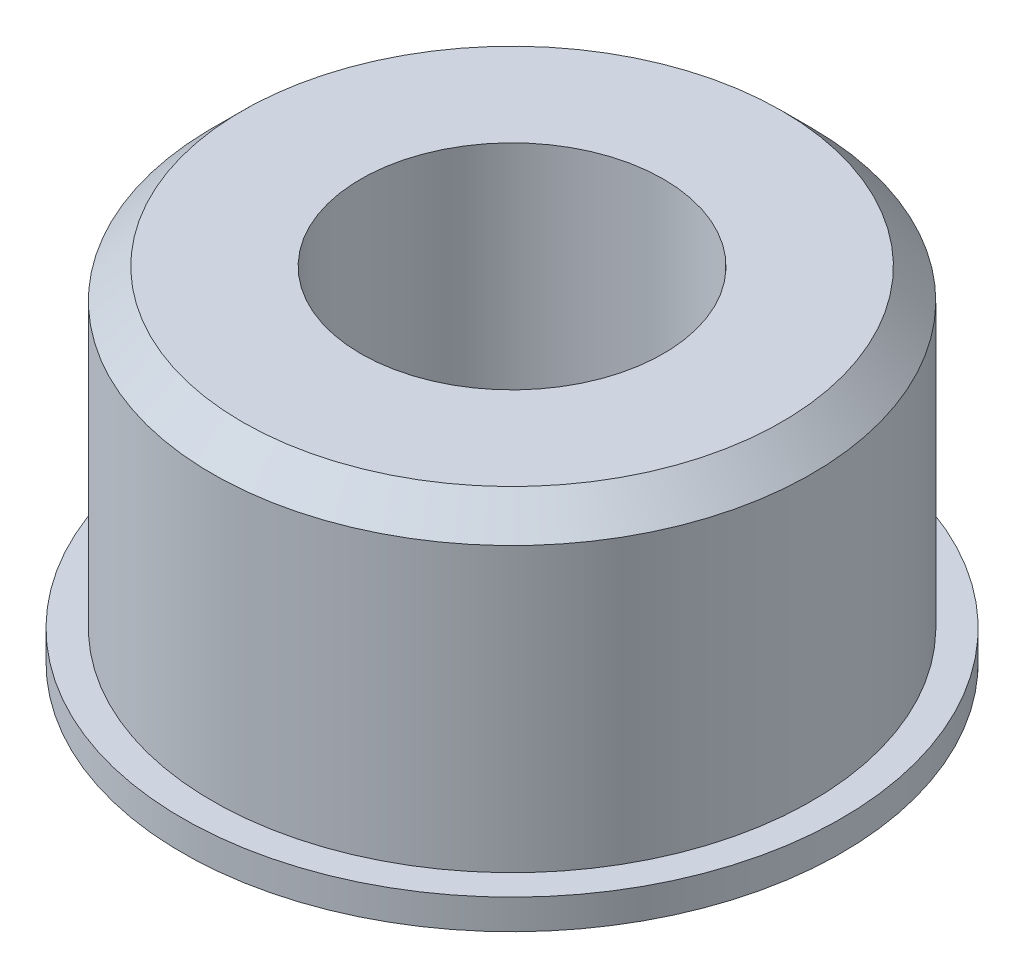
ISO-10303-21;
HEADER;
FILE_DESCRIPTION(('STEP AP214'),'2;1');
FILE_NAME('part.step','',(''),(''),'','','');
FILE_SCHEMA(('AUTOMOTIVE_DESIGN { 1 0 10303 214 1 1 1 1 }'));
ENDSEC;
DATA;
#1=APPLICATION_CONTEXT('core data for automotive mechanical design processes');
#2=APPLICATION_PROTOCOL_DEFINITION('international standard','automotive_design',2000,#1);
#3=PRODUCT_CONTEXT('',#1,'mechanical');
#4=PRODUCT('Part','Part','',(#3));
#5=PRODUCT_RELATED_PRODUCT_CATEGORY('part','',(#4));
#6=PRODUCT_DEFINITION_FORMATION('','',#4);
#7=PRODUCT_DEFINITION_CONTEXT('part definition',#1,'design');
#8=PRODUCT_DEFINITION('design','',#6,#7);
#9=PRODUCT_DEFINITION_SHAPE('','',#8);
#10=(LENGTH_UNIT() NAMED_UNIT(*) SI_UNIT(.MILLI.,.METRE.));
#11=(NAMED_UNIT(*) PLANE_ANGLE_UNIT() SI_UNIT($,.RADIAN.));
#12=(NAMED_UNIT(*) SI_UNIT($,.STERADIAN.) SOLID_ANGLE_UNIT());
#13=UNCERTAINTY_MEASURE_WITH_UNIT(LENGTH_MEASURE(1.E-05),#10,'distance_accuracy_value','');
#14=(GEOMETRIC_REPRESENTATION_CONTEXT(3) GLOBAL_UNCERTAINTY_ASSIGNED_CONTEXT((#13)) GLOBAL_UNIT_ASSIGNED_CONTEXT((#10,
#11,#12)) REPRESENTATION_CONTEXT('',''));
#15=CARTESIAN_POINT('',(0.,0.,0.));
#16=DIRECTION('',(0.,0.,1.));
#17=DIRECTION('',(1.,0.,0.));
#18=AXIS2_PLACEMENT_3D('',#15,#16,#17);
#19=CARTESIAN_POINT('',(-10.,0.,0.));
#20=DIRECTION('',(0.,-1.,0.));
#21=DIRECTION('',(0.,0.,-1.));
#22=AXIS2_PLACEMENT_3D('',#19,#20,#21);
#23=PLANE('',#22);
#24=CARTESIAN_POINT('',(0.,0.,0.));
#25=DIRECTION('',(0.,-1.,0.));
#26=DIRECTION('',(0.,0.,-1.));
#27=AXIS2_PLACEMENT_3D('',#24,#25,#26);
#28=CIRCLE('',#27,11.);
#29=CARTESIAN_POINT('',(0.,0.,-11.));
#30=VERTEX_POINT('',#29);
#31=EDGE_CURVE('E10',#30,#30,#28,.T.);
#32=ORIENTED_EDGE('',*,*,#31,.F.);
#33=EDGE_LOOP('',(#32));
#34=FACE_BOUND('',#33,.T.);
#35=CARTESIAN_POINT('',(0.,0.,0.));
#36=DIRECTION('',(0.,-1.,0.));
#37=DIRECTION('',(0.,0.,-1.));
#38=AXIS2_PLACEMENT_3D('',#35,#36,#37);
#39=CIRCLE('',#38,10.);
#40=CARTESIAN_POINT('',(0.,0.,-10.));
#41=VERTEX_POINT('',#40);
#42=EDGE_CURVE('E82',#41,#41,#39,.T.);
#43=ORIENTED_EDGE('',*,*,#42,.T.);
#44=EDGE_LOOP('',(#43));
#45=FACE_BOUND('',#44,.T.);
#46=ADVANCED_FACE('F43',(#34,#45),#23,.F.);
#47=CARTESIAN_POINT('',(0.,0.,0.));
#48=DIRECTION('',(0.,-1.,0.));
#49=DIRECTION('',(0.,0.,-1.));
#50=AXIS2_PLACEMENT_3D('',#47,#48,#49);
#51=CYLINDRICAL_SURFACE('',#50,11.);
#52=CARTESIAN_POINT('',(0.,-1.,0.));
#53=DIRECTION('',(0.,-1.,0.));
#54=DIRECTION('',(0.,0.,-1.));
#55=AXIS2_PLACEMENT_3D('',#52,#53,#54);
#56=CIRCLE('',#55,11.);
#57=CARTESIAN_POINT('',(0.,-1.,-11.));
#58=VERTEX_POINT('',#57);
#59=EDGE_CURVE('E50',#58,#58,#56,.T.);
#60=ORIENTED_EDGE('',*,*,#59,.F.);
#61=EDGE_LOOP('',(#60));
#62=FACE_BOUND('',#61,.T.);
#63=ORIENTED_EDGE('',*,*,#31,.T.);
#64=EDGE_LOOP('',(#63));
#65=FACE_BOUND('',#64,.T.);
#66=ADVANCED_FACE('F126',(#62,#65),#51,.T.);
#67=CARTESIAN_POINT('',(-11.,-1.,0.));
#68=DIRECTION('',(0.,1.,0.));
#69=DIRECTION('',(0.,0.,1.));
#70=AXIS2_PLACEMENT_3D('',#67,#68,#69);
#71=PLANE('',#70);
#72=CARTESIAN_POINT('',(0.,-1.,0.));
#73=DIRECTION('',(0.,-1.,0.));
#74=DIRECTION('',(0.,0.,-1.));
#75=AXIS2_PLACEMENT_3D('',#72,#73,#74);
#76=CIRCLE('',#75,8.25);
#77=CARTESIAN_POINT('',(0.,-1.,-8.25));
#78=VERTEX_POINT('',#77);
#79=EDGE_CURVE('E55',#78,#78,#76,.T.);
#80=ORIENTED_EDGE('',*,*,#79,.F.);
#81=EDGE_LOOP('',(#80));
#82=FACE_BOUND('',#81,.T.);
#83=ORIENTED_EDGE('',*,*,#59,.T.);
#84=EDGE_LOOP('',(#83));
#85=FACE_BOUND('',#84,.T.);
#86=ADVANCED_FACE('F121',(#82,#85),#71,.F.);
#87=CARTESIAN_POINT('',(0.,0.,0.));
#88=DIRECTION('',(0.,-1.,0.));
#89=DIRECTION('',(0.,0.,-1.));
#90=AXIS2_PLACEMENT_3D('',#87,#88,#89);
#91=CYLINDRICAL_SURFACE('',#90,8.25);
#92=CARTESIAN_POINT('',(0.,2.955,0.));
#93=DIRECTION('',(0.,-1.,0.));
#94=DIRECTION('',(0.,0.,-1.));
#95=AXIS2_PLACEMENT_3D('',#92,#93,#94);
#96=CIRCLE('',#95,8.25);
#97=CARTESIAN_POINT('',(0.,2.955,-8.25));
#98=VERTEX_POINT('',#97);
#99=EDGE_CURVE('E60',#98,#98,#96,.T.);
#100=ORIENTED_EDGE('',*,*,#99,.F.);
#101=EDGE_LOOP('',(#100));
#102=FACE_BOUND('',#101,.T.);
#103=ORIENTED_EDGE('',*,*,#79,.T.);
#104=EDGE_LOOP('',(#103));
#105=FACE_BOUND('',#104,.T.);
#106=ADVANCED_FACE('F115',(#102,#105),#91,.F.);
#107=CARTESIAN_POINT('',(-8.25,2.955,0.));
#108=DIRECTION('',(0.,1.,0.));
#109=DIRECTION('',(0.,0.,1.));
#110=AXIS2_PLACEMENT_3D('',#107,#108,#109);
#111=PLANE('',#110);
#112=CARTESIAN_POINT('',(0.,2.955,0.));
#113=DIRECTION('',(0.,-1.,0.));
#114=DIRECTION('',(0.,0.,-1.));
#115=AXIS2_PLACEMENT_3D('',#112,#113,#114);
#116=CIRCLE('',#115,5.05);
#117=CARTESIAN_POINT('',(0.,2.955,-5.05));
#118=VERTEX_POINT('',#117);
#119=EDGE_CURVE('E66',#118,#118,#116,.T.);
#120=ORIENTED_EDGE('',*,*,#119,.F.);
#121=EDGE_LOOP('',(#120));
#122=FACE_BOUND('',#121,.T.);
#123=ORIENTED_EDGE('',*,*,#99,.T.);
#124=EDGE_LOOP('',(#123));
#125=FACE_BOUND('',#124,.T.);
#126=ADVANCED_FACE('F109',(#122,#125),#111,.F.);
#127=CARTESIAN_POINT('',(0.,0.,0.));
#128=DIRECTION('',(0.,-1.,0.));
#129=DIRECTION('',(0.,0.,-1.));
#130=AXIS2_PLACEMENT_3D('',#127,#128,#129);
#131=CYLINDRICAL_SURFACE('',#130,5.05);
#132=CARTESIAN_POINT('',(0.,10.455,0.));
#133=DIRECTION('',(0.,-1.,0.));
#134=DIRECTION('',(0.,0.,-1.));
#135=AXIS2_PLACEMENT_3D('',#132,#133,#134);
#136=CIRCLE('',#135,5.05);
#137=CARTESIAN_POINT('',(0.,10.455,-5.05));
#138=VERTEX_POINT('',#137);
#139=EDGE_CURVE('E70',#138,#138,#136,.T.);
#140=ORIENTED_EDGE('',*,*,#139,.F.);
#141=EDGE_LOOP('',(#140));
#142=FACE_BOUND('',#141,.T.);
#143=ORIENTED_EDGE('',*,*,#119,.T.);
#144=EDGE_LOOP('',(#143));
#145=FACE_BOUND('',#144,.T.);
#146=ADVANCED_FACE('F103',(#142,#145),#131,.F.);
#147=CARTESIAN_POINT('',(-5.05,10.455,0.));
#148=DIRECTION('',(0.,-1.,0.));
#149=DIRECTION('',(0.,0.,-1.));
#150=AXIS2_PLACEMENT_3D('',#147,#148,#149);
#151=PLANE('',#150);
#152=CARTESIAN_POINT('',(0.,10.455,0.));
#153=DIRECTION('',(0.,-1.,0.));
#154=DIRECTION('',(0.,0.,-1.));
#155=AXIS2_PLACEMENT_3D('',#152,#153,#154);
#156=CIRCLE('',#155,9.);
#157=CARTESIAN_POINT('',(0.,10.455,-9.));
#158=VERTEX_POINT('',#157);
#159=EDGE_CURVE('E74',#158,#158,#156,.T.);
#160=ORIENTED_EDGE('',*,*,#159,.F.);
#161=EDGE_LOOP('',(#160));
#162=FACE_BOUND('',#161,.T.);
#163=ORIENTED_EDGE('',*,*,#139,.T.);
#164=EDGE_LOOP('',(#163));
#165=FACE_BOUND('',#164,.T.);
#166=ADVANCED_FACE('F97',(#162,#165),#151,.F.);
#167=CARTESIAN_POINT('',(0.,10.455,0.));
#168=DIRECTION('',(0.,-1.,0.));
#169=DIRECTION('',(0.,0.,-1.));
#170=AXIS2_PLACEMENT_3D('',#167,#168,#169);
#171=CONICAL_SURFACE('',#170,9.,0.785398163397447);
#172=CARTESIAN_POINT('',(0.,9.455,0.));
#173=DIRECTION('',(0.,-1.,0.));
#174=DIRECTION('',(0.,0.,-1.));
#175=AXIS2_PLACEMENT_3D('',#172,#173,#174);
#176=CIRCLE('',#175,10.);
#177=CARTESIAN_POINT('',(0.,9.455,-10.));
#178=VERTEX_POINT('',#177);
#179=EDGE_CURVE('E78',#178,#178,#176,.T.);
#180=ORIENTED_EDGE('',*,*,#179,.F.);
#181=EDGE_LOOP('',(#180));
#182=FACE_BOUND('',#181,.T.);
#183=ORIENTED_EDGE('',*,*,#159,.T.);
#184=EDGE_LOOP('',(#183));
#185=FACE_BOUND('',#184,.T.);
#186=ADVANCED_FACE('F91',(#182,#185),#171,.T.);
#187=CARTESIAN_POINT('',(0.,0.,0.));
#188=DIRECTION('',(0.,-1.,0.));
#189=DIRECTION('',(0.,0.,-1.));
#190=AXIS2_PLACEMENT_3D('',#187,#188,#189);
#191=CYLINDRICAL_SURFACE('',#190,10.);
#192=ORIENTED_EDGE('',*,*,#42,.F.);
#193=EDGE_LOOP('',(#192));
#194=FACE_BOUND('',#193,.T.);
#195=ORIENTED_EDGE('',*,*,#179,.T.);
#196=EDGE_LOOP('',(#195));
#197=FACE_BOUND('',#196,.T.);
#198=ADVANCED_FACE('F88',(#194,#197),#191,.T.);
#199=CLOSED_SHELL('',(#46,#66,#86,#106,#126,#146,#166,#186,#198));
#200=MANIFOLD_SOLID_BREP('B2',#199);
#201=ADVANCED_BREP_SHAPE_REPRESENTATION('',(#18,#200),#14);
#202=SHAPE_DEFINITION_REPRESENTATION(#9,#201);
ENDSEC;
END-ISO-10303-21;
